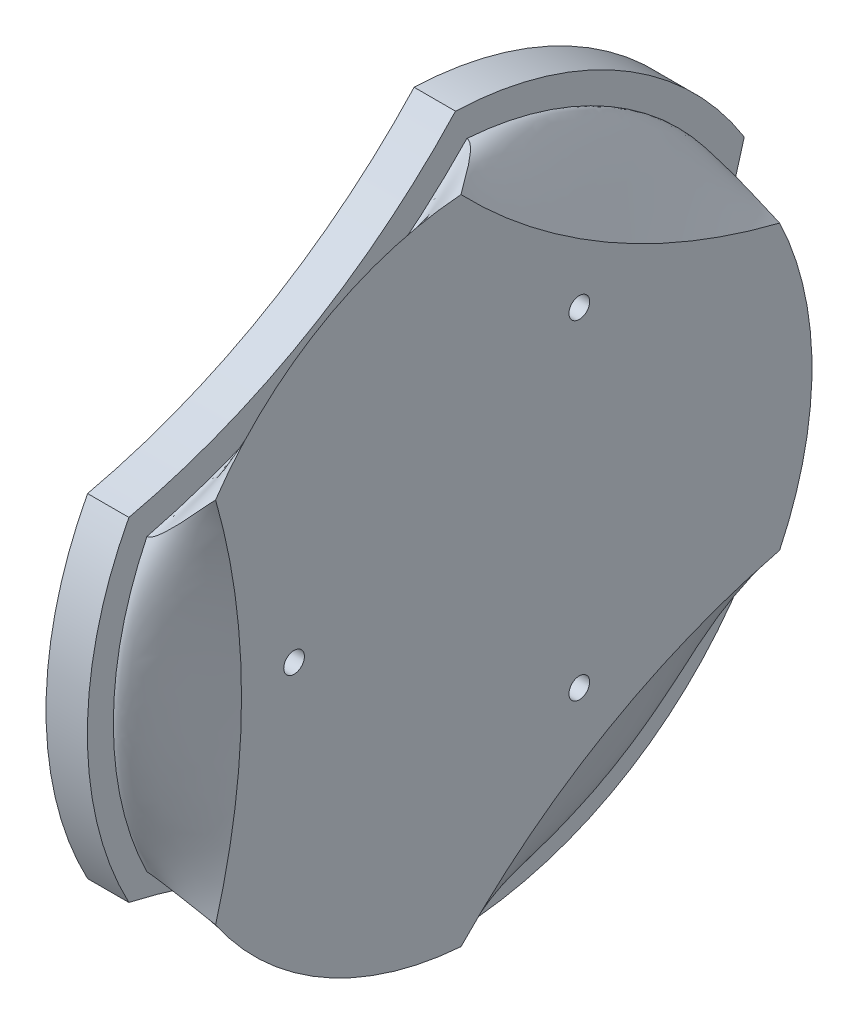
ISO-10303-21;
HEADER;
FILE_DESCRIPTION(('STEP AP214'),'2;1');
FILE_NAME('part.step','',(''),(''),'','','');
FILE_SCHEMA(('AUTOMOTIVE_DESIGN { 1 0 10303 214 1 1 1 1 }'));
ENDSEC;
DATA;
#1=APPLICATION_CONTEXT('core data for automotive mechanical design processes');
#2=APPLICATION_PROTOCOL_DEFINITION('international standard','automotive_design',2000,#1);
#3=PRODUCT_CONTEXT('',#1,'mechanical');
#4=PRODUCT('Part','Part','',(#3));
#5=PRODUCT_RELATED_PRODUCT_CATEGORY('part','',(#4));
#6=PRODUCT_DEFINITION_FORMATION('','',#4);
#7=PRODUCT_DEFINITION_CONTEXT('part definition',#1,'design');
#8=PRODUCT_DEFINITION('design','',#6,#7);
#9=PRODUCT_DEFINITION_SHAPE('','',#8);
#10=(LENGTH_UNIT() NAMED_UNIT(*) SI_UNIT(.MILLI.,.METRE.));
#11=(NAMED_UNIT(*) PLANE_ANGLE_UNIT() SI_UNIT($,.RADIAN.));
#12=(NAMED_UNIT(*) SI_UNIT($,.STERADIAN.) SOLID_ANGLE_UNIT());
#13=UNCERTAINTY_MEASURE_WITH_UNIT(LENGTH_MEASURE(1.E-05),#10,'distance_accuracy_value','');
#14=(GEOMETRIC_REPRESENTATION_CONTEXT(3) GLOBAL_UNCERTAINTY_ASSIGNED_CONTEXT((#13)) GLOBAL_UNIT_ASSIGNED_CONTEXT((#10,
#11,#12)) REPRESENTATION_CONTEXT('',''));
#15=CARTESIAN_POINT('',(0.,0.,0.));
#16=DIRECTION('',(0.,0.,1.));
#17=DIRECTION('',(1.,0.,0.));
#18=AXIS2_PLACEMENT_3D('',#15,#16,#17);
#19=CARTESIAN_POINT('',(0.,81.1226705898772,102.240909226466));
#20=DIRECTION('',(1.,0.,0.));
#21=DIRECTION('',(0.,0.86602540378444,-0.499999999999998));
#22=AXIS2_PLACEMENT_3D('',#19,#20,#21);
#23=PLANE('',#22);
#24=CARTESIAN_POINT('',(0.,129.242914733026,152.882547039961));
#25=DIRECTION('',(1.,0.,0.));
#26=DIRECTION('',(0.,0.,-1.));
#27=AXIS2_PLACEMENT_3D('',#24,#25,#26);
#28=CIRCLE('',#27,1.25000000000001);
#29=CARTESIAN_POINT('',(0.,129.242914733026,151.632547039961));
#30=VERTEX_POINT('',#29);
#31=EDGE_CURVE('E625',#30,#30,#28,.F.);
#32=ORIENTED_EDGE('',*,*,#31,.T.);
#33=EDGE_LOOP('',(#32));
#34=FACE_BOUND('',#33,.T.);
#35=CARTESIAN_POINT('',(0.,149.161499020068,118.382547039961));
#36=DIRECTION('',(1.,0.,0.));
#37=DIRECTION('',(0.,0.,-1.));
#38=AXIS2_PLACEMENT_3D('',#35,#36,#37);
#39=CIRCLE('',#38,1.25);
#40=CARTESIAN_POINT('',(0.,149.161499020068,117.132547039961));
#41=VERTEX_POINT('',#40);
#42=EDGE_CURVE('E626',#41,#41,#39,.F.);
#43=ORIENTED_EDGE('',*,*,#42,.T.);
#44=EDGE_LOOP('',(#43));
#45=FACE_BOUND('',#44,.T.);
#46=CARTESIAN_POINT('',(0.,109.324330445983,118.382547039961));
#47=DIRECTION('',(1.,0.,0.));
#48=DIRECTION('',(0.,0.,-1.));
#49=AXIS2_PLACEMENT_3D('',#46,#47,#48);
#50=CIRCLE('',#49,1.25);
#51=CARTESIAN_POINT('',(0.,109.324330445983,117.132547039961));
#52=VERTEX_POINT('',#51);
#53=EDGE_CURVE('E628',#52,#52,#50,.F.);
#54=ORIENTED_EDGE('',*,*,#53,.T.);
#55=EDGE_LOOP('',(#54));
#56=FACE_BOUND('',#55,.T.);
#57=CARTESIAN_POINT('',(0.,33.4912733817331,74.7409092264656));
#58=DIRECTION('',(-1.,0.,0.));
#59=DIRECTION('',(0.,0.86602540378444,-0.499999999999998));
#60=AXIS2_PLACEMENT_3D('',#57,#58,#59);
#61=CIRCLE('',#60,80.5000000000001);
#62=CARTESIAN_POINT('',(0.,89.3645268236646,132.69286820814));
#63=VERTEX_POINT('',#62);
#64=CARTESIAN_POINT('',(0.,111.615768779903,94.152586608428));
#65=VERTEX_POINT('',#64);
#66=EDGE_CURVE('E498',#63,#65,#61,.T.);
#67=ORIENTED_EDGE('',*,*,#66,.T.);
#68=CARTESIAN_POINT('',(0.,128.754067798021,129.740909226466));
#69=DIRECTION('',(1.,0.,0.));
#70=DIRECTION('',(0.,0.86602540378444,-0.499999999999998));
#71=AXIS2_PLACEMENT_3D('',#68,#69,#70);
#72=CIRCLE('',#71,39.5);
#73=CARTESIAN_POINT('',(0.,145.89236681614,94.1525866084281));
#74=VERTEX_POINT('',#73);
#75=EDGE_CURVE('E12',#65,#74,#72,.T.);
#76=ORIENTED_EDGE('',*,*,#75,.T.);
#77=CARTESIAN_POINT('',(0.,224.01686221431,74.7409092264666));
#78=DIRECTION('',(-1.,0.,0.));
#79=DIRECTION('',(0.,0.86602540378444,-0.499999999999998));
#80=AXIS2_PLACEMENT_3D('',#77,#78,#79);
#81=CIRCLE('',#80,80.5000000000001);
#82=CARTESIAN_POINT('',(0.,168.143608772378,132.692868208141));
#83=VERTEX_POINT('',#82);
#84=EDGE_CURVE('E151',#74,#83,#81,.T.);
#85=ORIENTED_EDGE('',*,*,#84,.T.);
#86=CARTESIAN_POINT('',(0.,128.754067798021,129.740909226466));
#87=DIRECTION('',(1.,0.,0.));
#88=DIRECTION('',(0.,0.86602540378444,-0.499999999999998));
#89=AXIS2_PLACEMENT_3D('',#86,#87,#88);
#90=CIRCLE('',#89,39.5);
#91=CARTESIAN_POINT('',(0.,151.005309754259,162.37727286283));
#92=VERTEX_POINT('',#91);
#93=EDGE_CURVE('E512',#83,#92,#90,.T.);
#94=ORIENTED_EDGE('',*,*,#93,.T.);
#95=CARTESIAN_POINT('',(0.,128.754067798021,239.740909226466));
#96=DIRECTION('',(-1.,0.,0.));
#97=DIRECTION('',(0.,0.86602540378444,-0.499999999999998));
#98=AXIS2_PLACEMENT_3D('',#95,#96,#97);
#99=CIRCLE('',#98,80.5000000000001);
#100=CARTESIAN_POINT('',(0.,106.502825841783,162.37727286283));
#101=VERTEX_POINT('',#100);
#102=EDGE_CURVE('E164',#92,#101,#99,.T.);
#103=ORIENTED_EDGE('',*,*,#102,.T.);
#104=CARTESIAN_POINT('',(0.,128.754067798021,129.740909226466));
#105=DIRECTION('',(1.,0.,0.));
#106=DIRECTION('',(0.,0.86602540378444,-0.499999999999998));
#107=AXIS2_PLACEMENT_3D('',#104,#105,#106);
#108=CIRCLE('',#107,39.5);
#109=EDGE_CURVE('E157',#101,#63,#108,.T.);
#110=ORIENTED_EDGE('',*,*,#109,.T.);
#111=EDGE_LOOP('',(#67,#76,#85,#94,#103,#110));
#112=FACE_BOUND('',#111,.T.);
#113=ADVANCED_FACE('F143',(#34,#45,#56,#112),#23,.T.);
#114=CARTESIAN_POINT('',(-5.,88.8489863312597,126.986917009496));
#115=CARTESIAN_POINT('',(-4.0114556801729,88.8489863312597,126.986917009496));
#116=CARTESIAN_POINT('',(-2.00572784008645,89.1067565774621,129.839892608818));
#117=CARTESIAN_POINT('',(0.,89.3645268236646,132.69286820814));
#118=CARTESIAN_POINT('',(-5.,89.6984129965735,114.67880659781));
#119=CARTESIAN_POINT('',(-4.0114556801729,89.6984129965735,114.67880659781));
#120=CARTESIAN_POINT('',(-2.00572784008645,94.9768947157659,118.435737050697));
#121=CARTESIAN_POINT('',(0.,100.255376434958,122.192667503584));
#122=CARTESIAN_POINT('',(-5.,96.1820768864736,103.448771321304));
#123=CARTESIAN_POINT('',(-4.01145568017291,96.1820768864736,103.448771321304));
#124=CARTESIAN_POINT('',(-2.00572784008645,102.074914958521,106.141605357093));
#125=CARTESIAN_POINT('',(0.,107.967753030569,108.834439392882));
#126=CARTESIAN_POINT('',(-5.,106.41649984292,96.5590910446478));
#127=CARTESIAN_POINT('',(-4.01145568017291,106.41649984292,96.5590910446478));
#128=CARTESIAN_POINT('',(-2.00572784008646,109.016134311411,95.3558388265379));
#129=CARTESIAN_POINT('',(0.,111.615768779903,94.1525866084281));
#130=B_SPLINE_SURFACE_WITH_KNOTS('',3,3,((#114,#115,#116,#117),(#118,#119,#120,#121),(#122,#123,
#124,#125),(#126,#127,#128,#129)),.UNSPECIFIED.,.F.,.F.,.F.,(4,4),(4,4),(0.,1.),(0.,1.),.UNSPECIFIED.);
#131=CARTESIAN_POINT('',(-5.,128.754067798021,129.740909226466));
#132=DIRECTION('',(1.,0.,0.));
#133=DIRECTION('',(0.,0.86602540378444,-0.499999999999998));
#134=AXIS2_PLACEMENT_3D('',#131,#132,#133);
#135=CIRCLE('',#134,40.);
#136=CARTESIAN_POINT('',(-5.,88.8489863312597,126.986917009496));
#137=VERTEX_POINT('',#136);
#138=CARTESIAN_POINT('',(-5.,106.41649984292,96.5590910446478));
#139=VERTEX_POINT('',#138);
#140=EDGE_CURVE('E144',#137,#139,#135,.T.);
#141=CARTESIAN_POINT('',(-5.,106.41649984292,96.5590910446478));
#142=CARTESIAN_POINT('',(-4.01145568017291,106.41649984292,96.5590910446478));
#143=CARTESIAN_POINT('',(-2.00572784008646,109.016134311411,95.3558388265379));
#144=CARTESIAN_POINT('',(0.,111.615768779903,94.1525866084281));
#145=B_SPLINE_CURVE_WITH_KNOTS('',3,(#141,#142,#143,#144),.UNSPECIFIED.,.F.,.F.,(4,4),(0.,1.),.UNSPECIFIED.);
#146=EDGE_CURVE('E427',#139,#65,#145,.T.);
#147=CARTESIAN_POINT('',(-5.,88.8489863312597,126.986917009496));
#148=CARTESIAN_POINT('',(-4.0114556801729,88.8489863312597,126.986917009496));
#149=CARTESIAN_POINT('',(-2.00572784008645,89.1067565774621,129.839892608818));
#150=CARTESIAN_POINT('',(0.,89.3645268236646,132.69286820814));
#151=B_SPLINE_CURVE_WITH_KNOTS('',3,(#147,#148,#149,#150),.UNSPECIFIED.,.F.,.F.,(4,4),(0.,1.),.UNSPECIFIED.);
#152=EDGE_CURVE('E423',#63,#137,#151,.F.);
#153=CARTESIAN_POINT('',(-5.,88.8489863312597,126.986917009496));
#154=CARTESIAN_POINT('',(-4.0114556801729,88.8489863312597,126.986917009496));
#155=CARTESIAN_POINT('',(-2.00572784008645,89.1067565774621,129.839892608818));
#156=CARTESIAN_POINT('',(0.,89.3645268236646,132.69286820814));
#157=CARTESIAN_POINT('',(1.72492594247435E-05,89.3645290404887,132.69289274373));
#158=CARTESIAN_POINT('',(3.44985188494869E-05,89.3645312573129,132.692917279321));
#159=CARTESIAN_POINT('',(5.17477782742304E-05,89.364533474137,132.692941814911));
#160=CARTESIAN_POINT('',(-5.,89.6984129965735,114.67880659781));
#161=CARTESIAN_POINT('',(-4.0114556801729,89.6984129965735,114.67880659781));
#162=CARTESIAN_POINT('',(-2.00572784008645,94.9768947157659,118.435737050697));
#163=CARTESIAN_POINT('',(0.,100.255376434958,122.192667503584));
#164=CARTESIAN_POINT('',(1.72492594247435E-05,100.255421829901,122.192699813186));
#165=CARTESIAN_POINT('',(3.4498518849487E-05,100.255467224844,122.192732122788));
#166=CARTESIAN_POINT('',(5.17477782742304E-05,100.255512619787,122.19276443239));
#167=CARTESIAN_POINT('',(-5.,96.1820768864736,103.448771321304));
#168=CARTESIAN_POINT('',(-4.01145568017291,96.1820768864736,103.448771321304));
#169=CARTESIAN_POINT('',(-2.00572784008645,102.074914958521,106.141605357093));
#170=CARTESIAN_POINT('',(0.,107.967753030569,108.834439392882));
#171=CARTESIAN_POINT('',(1.72492594247435E-05,107.967803708976,108.834462551255));
#172=CARTESIAN_POINT('',(3.4498518849487E-05,107.967854387384,108.834485709628));
#173=CARTESIAN_POINT('',(5.17477782742305E-05,107.967905065791,108.834508868));
#174=CARTESIAN_POINT('',(-5.,106.41649984292,96.5590910446478));
#175=CARTESIAN_POINT('',(-4.01145568017291,106.41649984292,96.5590910446478));
#176=CARTESIAN_POINT('',(-2.00572784008646,109.016134311411,95.3558388265379));
#177=CARTESIAN_POINT('',(0.,111.615768779903,94.1525866084281));
#178=CARTESIAN_POINT('',(1.72492594247435E-05,111.615791136759,94.152576260459));
#179=CARTESIAN_POINT('',(3.4498518849487E-05,111.615813493616,94.1525659124899));
#180=CARTESIAN_POINT('',(5.17477782742305E-05,111.615835850472,94.1525555645208));
#181=B_SPLINE_SURFACE_WITH_KNOTS('',3,3,((#153,#154,#155,#156,#157,#158,#159),(#160,#161,#162,
#163,#164,#165,#166),(#167,#168,#169,#170,#171,#172,#173),(#174,#175,#176,#177,#178,#179,#180)),
.UNSPECIFIED.,.F.,.F.,.F.,(4,4),(4,3,4),(0.,1.),(0.,1.,1.0000086),.UNSPECIFIED.);
#182=ORIENTED_EDGE('',*,*,#140,.T.);
#183=ORIENTED_EDGE('',*,*,#146,.T.);
#184=ORIENTED_EDGE('',*,*,#66,.F.);
#185=ORIENTED_EDGE('',*,*,#152,.T.);
#186=EDGE_LOOP('',(#182,#183,#184,#185));
#187=FACE_BOUND('',#186,.T.);
#188=ADVANCED_FACE('F443',(#187),#181,.T.);
#189=CARTESIAN_POINT('',(-5.,106.41649984292,96.5590910446477));
#190=CARTESIAN_POINT('',(-4.01145568017291,106.41649984292,96.5590910446477));
#191=CARTESIAN_POINT('',(-2.00572784008645,109.016134311411,95.3558388265379));
#192=CARTESIAN_POINT('',(0.,111.615768779903,94.152586608428));
#193=CARTESIAN_POINT('',(-5.,121.005493386461,100.801350194268));
#194=CARTESIAN_POINT('',(-4.0114556801729,121.005493386461,100.801350194268));
#195=CARTESIAN_POINT('',(-2.00572784008645,121.725345968693,94.8693995141673));
#196=CARTESIAN_POINT('',(0.,122.445198550925,88.9374488340664));
#197=CARTESIAN_POINT('',(-5.,136.502642209581,100.801350194268));
#198=CARTESIAN_POINT('',(-4.01145568017289,136.502642209581,100.801350194268));
#199=CARTESIAN_POINT('',(-2.00572784008644,135.782789627349,94.8693995141673));
#200=CARTESIAN_POINT('',(0.,135.062937045117,88.9374488340664));
#201=CARTESIAN_POINT('',(-5.,151.091635753123,96.559091044648));
#202=CARTESIAN_POINT('',(-4.01145568017288,151.091635753123,96.559091044648));
#203=CARTESIAN_POINT('',(-2.00572784008644,148.492001284631,95.3558388265381));
#204=CARTESIAN_POINT('',(0.,145.89236681614,94.1525866084281));
#205=B_SPLINE_SURFACE_WITH_KNOTS('',3,3,((#189,#190,#191,#192),(#193,#194,#195,#196),(#197,#198,
#199,#200),(#201,#202,#203,#204)),.UNSPECIFIED.,.F.,.F.,.F.,(4,4),(4,4),(0.,1.),(0.,1.),.UNSPECIFIED.);
#206=CARTESIAN_POINT('',(-5.,128.754067798022,19.740909226466));
#207=DIRECTION('',(-1.,0.,0.));
#208=DIRECTION('',(0.,0.86602540378444,-0.499999999999998));
#209=AXIS2_PLACEMENT_3D('',#206,#207,#208);
#210=CIRCLE('',#209,80.0000000000001);
#211=CARTESIAN_POINT('',(-5.,151.091635753123,96.5590910446481));
#212=VERTEX_POINT('',#211);
#213=EDGE_CURVE('E477',#139,#212,#210,.T.);
#214=CARTESIAN_POINT('',(-5.,151.091635753123,96.559091044648));
#215=CARTESIAN_POINT('',(-4.01145568017288,151.091635753123,96.559091044648));
#216=CARTESIAN_POINT('',(-2.00572784008644,148.492001284631,95.3558388265381));
#217=CARTESIAN_POINT('',(0.,145.89236681614,94.1525866084281));
#218=B_SPLINE_CURVE_WITH_KNOTS('',3,(#214,#215,#216,#217),.UNSPECIFIED.,.F.,.F.,(4,4),(0.,1.),.UNSPECIFIED.);
#219=EDGE_CURVE('E539',#212,#74,#218,.T.);
#220=ORIENTED_EDGE('',*,*,#213,.T.);
#221=ORIENTED_EDGE('',*,*,#219,.T.);
#222=ORIENTED_EDGE('',*,*,#75,.F.);
#223=ORIENTED_EDGE('',*,*,#146,.F.);
#224=EDGE_LOOP('',(#220,#221,#222,#223));
#225=FACE_BOUND('',#224,.T.);
#226=ADVANCED_FACE('F404',(#225),#205,.T.);
#227=CARTESIAN_POINT('',(-5.,111.186554286361,165.676719625254));
#228=CARTESIAN_POINT('',(-4.01145568017291,111.186554286361,165.676719625254));
#229=CARTESIAN_POINT('',(-2.00572784008645,108.844690064072,164.026996244042));
#230=CARTESIAN_POINT('',(0.,106.502825841783,162.37727286283));
#231=CARTESIAN_POINT('',(-5.,107.565961707598,150.92115102609));
#232=CARTESIAN_POINT('',(-4.0114556801729,107.565961707598,150.92115102609));
#233=CARTESIAN_POINT('',(-2.00572784008645,102.068815433519,153.263715742948));
#234=CARTESIAN_POINT('',(0.,96.5716691594388,155.606280459805));
#235=CARTESIAN_POINT('',(-5.,99.8173872960383,137.50022645904));
#236=CARTESIAN_POINT('',(-4.0114556801729,99.8173872960383,137.50022645904));
#237=CARTESIAN_POINT('',(-2.00572784008645,95.0400936041905,141.089612422283));
#238=CARTESIAN_POINT('',(0.,90.2627999123428,144.678998385526));
#239=CARTESIAN_POINT('',(-5.,88.8489863312597,126.986917009496));
#240=CARTESIAN_POINT('',(-4.0114556801729,88.8489863312597,126.986917009496));
#241=CARTESIAN_POINT('',(-2.00572784008645,89.1067565774622,129.839892608818));
#242=CARTESIAN_POINT('',(0.,89.3645268236646,132.69286820814));
#243=B_SPLINE_SURFACE_WITH_KNOTS('',3,3,((#227,#228,#229,#230),(#231,#232,#233,#234),(#235,#236,
#237,#238),(#239,#240,#241,#242)),.UNSPECIFIED.,.F.,.F.,.F.,(4,4),(4,4),(0.,1.),(0.,1.),.UNSPECIFIED.);
#244=CARTESIAN_POINT('',(-5.,33.4912733817325,184.740909226465));
#245=DIRECTION('',(-1.,0.,0.));
#246=DIRECTION('',(0.,0.86602540378444,-0.499999999999998));
#247=AXIS2_PLACEMENT_3D('',#244,#245,#246);
#248=CIRCLE('',#247,80.);
#249=CARTESIAN_POINT('',(-5.,111.186554286361,165.676719625254));
#250=VERTEX_POINT('',#249);
#251=EDGE_CURVE('E261',#250,#137,#248,.T.);
#252=CARTESIAN_POINT('',(-5.,111.186554286361,165.676719625254));
#253=CARTESIAN_POINT('',(-4.01145568017291,111.186554286361,165.676719625254));
#254=CARTESIAN_POINT('',(-2.00572784008645,108.844690064072,164.026996244042));
#255=CARTESIAN_POINT('',(0.,106.502825841783,162.37727286283));
#256=B_SPLINE_CURVE_WITH_KNOTS('',3,(#252,#253,#254,#255),.UNSPECIFIED.,.F.,.F.,(4,4),(0.,1.),.UNSPECIFIED.);
#257=EDGE_CURVE('E541',#250,#101,#256,.T.);
#258=ORIENTED_EDGE('',*,*,#251,.T.);
#259=ORIENTED_EDGE('',*,*,#152,.F.);
#260=ORIENTED_EDGE('',*,*,#109,.F.);
#261=ORIENTED_EDGE('',*,*,#257,.F.);
#262=EDGE_LOOP('',(#258,#259,#260,#261));
#263=FACE_BOUND('',#262,.T.);
#264=ADVANCED_FACE('F392',(#263),#243,.T.);
#265=CARTESIAN_POINT('',(-5.,151.091635753123,96.559091044648));
#266=CARTESIAN_POINT('',(-4.01145568017288,151.091635753123,96.559091044648));
#267=CARTESIAN_POINT('',(-2.00572784008644,148.492001284631,95.3558388265381));
#268=CARTESIAN_POINT('',(0.,145.89236681614,94.1525866084281));
#269=CARTESIAN_POINT('',(-5.,161.326058709569,103.448771321305));
#270=CARTESIAN_POINT('',(-4.01145568017288,161.326058709569,103.448771321305));
#271=CARTESIAN_POINT('',(-2.00572784008644,155.433220637521,106.141605357093));
#272=CARTESIAN_POINT('',(0.,149.540382565474,108.834439392882));
#273=CARTESIAN_POINT('',(-5.,167.809722599469,114.678806597811));
#274=CARTESIAN_POINT('',(-4.01145568017289,167.809722599469,114.678806597811));
#275=CARTESIAN_POINT('',(-2.00572784008644,162.531240880277,118.435737050698));
#276=CARTESIAN_POINT('',(0.,157.252759161084,122.192667503585));
#277=CARTESIAN_POINT('',(-5.,168.659149264783,126.986917009497));
#278=CARTESIAN_POINT('',(-4.01145568017289,168.659149264783,126.986917009497));
#279=CARTESIAN_POINT('',(-2.00572784008645,168.40137901858,129.839892608819));
#280=CARTESIAN_POINT('',(0.,168.143608772378,132.692868208141));
#281=B_SPLINE_SURFACE_WITH_KNOTS('',3,3,((#265,#266,#267,#268),(#269,#270,#271,#272),(#273,#274,
#275,#276),(#277,#278,#279,#280)),.UNSPECIFIED.,.F.,.F.,.F.,(4,4),(4,4),(0.,1.),(0.,1.),.UNSPECIFIED.);
#282=CARTESIAN_POINT('',(-5.,128.754067798021,129.740909226466));
#283=DIRECTION('',(1.,0.,0.));
#284=DIRECTION('',(0.,0.86602540378444,-0.499999999999998));
#285=AXIS2_PLACEMENT_3D('',#282,#283,#284);
#286=CIRCLE('',#285,40.0000000000001);
#287=CARTESIAN_POINT('',(-5.,168.659149264783,126.986917009497));
#288=VERTEX_POINT('',#287);
#289=EDGE_CURVE('E480',#212,#288,#286,.T.);
#290=CARTESIAN_POINT('',(-5.,168.659149264783,126.986917009497));
#291=CARTESIAN_POINT('',(-4.01145568017289,168.659149264783,126.986917009497));
#292=CARTESIAN_POINT('',(-2.00572784008645,168.40137901858,129.839892608819));
#293=CARTESIAN_POINT('',(0.,168.143608772378,132.692868208141));
#294=B_SPLINE_CURVE_WITH_KNOTS('',3,(#290,#291,#292,#293),.UNSPECIFIED.,.F.,.F.,(4,4),(0.,1.),.UNSPECIFIED.);
#295=EDGE_CURVE('E333',#288,#83,#294,.T.);
#296=CARTESIAN_POINT('',(-5.,151.091635753123,96.559091044648));
#297=CARTESIAN_POINT('',(-4.01145568017288,151.091635753123,96.559091044648));
#298=CARTESIAN_POINT('',(-2.00572784008644,148.492001284631,95.3558388265381));
#299=CARTESIAN_POINT('',(0.,145.89236681614,94.1525866084281));
#300=CARTESIAN_POINT('',(1.72492594247434E-05,145.892344459283,94.152576260459));
#301=CARTESIAN_POINT('',(3.44985188494868E-05,145.892322102427,94.15256591249));
#302=CARTESIAN_POINT('',(5.17477782742301E-05,145.892299745571,94.1525555645209));
#303=CARTESIAN_POINT('',(-5.,161.326058709569,103.448771321305));
#304=CARTESIAN_POINT('',(-4.01145568017288,161.326058709569,103.448771321305));
#305=CARTESIAN_POINT('',(-2.00572784008644,155.433220637521,106.141605357093));
#306=CARTESIAN_POINT('',(0.,149.540382565474,108.834439392882));
#307=CARTESIAN_POINT('',(1.72492594247434E-05,149.540331887066,108.834462551255));
#308=CARTESIAN_POINT('',(3.44985188494868E-05,149.540281208659,108.834485709628));
#309=CARTESIAN_POINT('',(5.17477782742302E-05,149.540230530251,108.834508868));
#310=CARTESIAN_POINT('',(-5.,167.809722599469,114.678806597811));
#311=CARTESIAN_POINT('',(-4.01145568017289,167.809722599469,114.678806597811));
#312=CARTESIAN_POINT('',(-2.00572784008644,162.531240880277,118.435737050698));
#313=CARTESIAN_POINT('',(0.,157.252759161084,122.192667503585));
#314=CARTESIAN_POINT('',(1.72492594247434E-05,157.252713766141,122.192699813187));
#315=CARTESIAN_POINT('',(3.44985188494868E-05,157.252668371198,122.192732122789));
#316=CARTESIAN_POINT('',(5.17477782742303E-05,157.252622976256,122.19276443239));
#317=CARTESIAN_POINT('',(-5.,168.659149264783,126.986917009497));
#318=CARTESIAN_POINT('',(-4.01145568017289,168.659149264783,126.986917009497));
#319=CARTESIAN_POINT('',(-2.00572784008645,168.40137901858,129.839892608819));
#320=CARTESIAN_POINT('',(0.,168.143608772378,132.692868208141));
#321=CARTESIAN_POINT('',(1.72492594247434E-05,168.143606555554,132.692892743731));
#322=CARTESIAN_POINT('',(3.44985188494869E-05,168.143604338729,132.692917279321));
#323=CARTESIAN_POINT('',(5.17477782742303E-05,168.143602121905,132.692941814911));
#324=B_SPLINE_SURFACE_WITH_KNOTS('',3,3,((#296,#297,#298,#299,#300,#301,#302),(#303,#304,#305,
#306,#307,#308,#309),(#310,#311,#312,#313,#314,#315,#316),(#317,#318,#319,#320,#321,#322,#323)),
.UNSPECIFIED.,.F.,.F.,.F.,(4,4),(4,3,4),(0.,1.),(0.,1.,1.0000086),.UNSPECIFIED.);
#325=ORIENTED_EDGE('',*,*,#289,.T.);
#326=ORIENTED_EDGE('',*,*,#295,.T.);
#327=ORIENTED_EDGE('',*,*,#84,.F.);
#328=ORIENTED_EDGE('',*,*,#219,.F.);
#329=EDGE_LOOP('',(#325,#326,#327,#328));
#330=FACE_BOUND('',#329,.T.);
#331=ADVANCED_FACE('F346',(#330),#324,.T.);
#332=CARTESIAN_POINT('',(-5.,168.659149264783,126.986917009497));
#333=CARTESIAN_POINT('',(-4.01145568017289,168.659149264783,126.986917009497));
#334=CARTESIAN_POINT('',(-2.00572784008645,168.40137901858,129.839892608819));
#335=CARTESIAN_POINT('',(0.,168.143608772378,132.692868208141));
#336=CARTESIAN_POINT('',(-5.,157.690748300004,137.50022645904));
#337=CARTESIAN_POINT('',(-4.01145568017289,157.690748300004,137.50022645904));
#338=CARTESIAN_POINT('',(-2.00572784008645,162.468041991852,141.089612422283));
#339=CARTESIAN_POINT('',(0.,167.245335683699,144.678998385527));
#340=CARTESIAN_POINT('',(-5.,149.942173888444,150.92115102609));
#341=CARTESIAN_POINT('',(-4.01145568017289,149.942173888444,150.92115102609));
#342=CARTESIAN_POINT('',(-2.00572784008644,155.439320162524,153.263715742948));
#343=CARTESIAN_POINT('',(0.,160.936466436603,155.606280459806));
#344=CARTESIAN_POINT('',(-5.,146.321581309681,165.676719625254));
#345=CARTESIAN_POINT('',(-4.01145568017288,146.321581309681,165.676719625254));
#346=CARTESIAN_POINT('',(-2.00572784008644,148.66344553197,164.026996244042));
#347=CARTESIAN_POINT('',(0.,151.005309754259,162.37727286283));
#348=B_SPLINE_SURFACE_WITH_KNOTS('',3,3,((#332,#333,#334,#335),(#336,#337,#338,#339),(#340,#341,
#342,#343),(#344,#345,#346,#347)),.UNSPECIFIED.,.F.,.F.,.F.,(4,4),(4,4),(0.,1.),(0.,1.),.UNSPECIFIED.);
#349=CARTESIAN_POINT('',(-5.,224.016862214309,184.740909226467));
#350=DIRECTION('',(-1.,0.,0.));
#351=DIRECTION('',(0.,0.86602540378444,-0.499999999999998));
#352=AXIS2_PLACEMENT_3D('',#349,#350,#351);
#353=CIRCLE('',#352,80.0000000000001);
#354=CARTESIAN_POINT('',(-5.,146.321581309681,165.676719625254));
#355=VERTEX_POINT('',#354);
#356=EDGE_CURVE('E329',#288,#355,#353,.T.);
#357=CARTESIAN_POINT('',(-5.,146.321581309681,165.676719625254));
#358=CARTESIAN_POINT('',(-4.01145568017288,146.321581309681,165.676719625254));
#359=CARTESIAN_POINT('',(-2.00572784008644,148.66344553197,164.026996244042));
#360=CARTESIAN_POINT('',(0.,151.005309754259,162.37727286283));
#361=B_SPLINE_CURVE_WITH_KNOTS('',3,(#357,#358,#359,#360),.UNSPECIFIED.,.F.,.F.,(4,4),(0.,1.),.UNSPECIFIED.);
#362=EDGE_CURVE('E538',#355,#92,#361,.T.);
#363=ORIENTED_EDGE('',*,*,#356,.T.);
#364=ORIENTED_EDGE('',*,*,#362,.T.);
#365=ORIENTED_EDGE('',*,*,#93,.F.);
#366=ORIENTED_EDGE('',*,*,#295,.F.);
#367=EDGE_LOOP('',(#363,#364,#365,#366));
#368=FACE_BOUND('',#367,.T.);
#369=ADVANCED_FACE('F340',(#368),#348,.T.);
#370=CARTESIAN_POINT('',(-5.,146.321581309681,165.676719625254));
#371=CARTESIAN_POINT('',(-4.01145568017288,146.321581309681,165.676719625254));
#372=CARTESIAN_POINT('',(-2.00572784008644,148.66344553197,164.026996244042));
#373=CARTESIAN_POINT('',(0.,151.005309754259,162.37727286283));
#374=CARTESIAN_POINT('',(-5.,135.237731687921,171.095149760283));
#375=CARTESIAN_POINT('',(-4.01145568017289,135.237731687921,171.095149760283));
#376=CARTESIAN_POINT('',(-2.00572784008645,135.852088040776,164.645385271607));
#377=CARTESIAN_POINT('',(0.,136.466444393631,158.195620782932));
#378=CARTESIAN_POINT('',(-5.,122.270403908121,171.095149760283));
#379=CARTESIAN_POINT('',(-4.0114556801729,122.270403908121,171.095149760283));
#380=CARTESIAN_POINT('',(-2.00572784008645,121.656047555266,164.645385271607));
#381=CARTESIAN_POINT('',(0.,121.041691202411,158.195620782932));
#382=CARTESIAN_POINT('',(-5.,111.186554286361,165.676719625254));
#383=CARTESIAN_POINT('',(-4.01145568017291,111.186554286361,165.676719625254));
#384=CARTESIAN_POINT('',(-2.00572784008645,108.844690064072,164.026996244042));
#385=CARTESIAN_POINT('',(0.,106.502825841783,162.37727286283));
#386=B_SPLINE_SURFACE_WITH_KNOTS('',3,3,((#370,#371,#372,#373),(#374,#375,#376,#377),(#378,#379,
#380,#381),(#382,#383,#384,#385)),.UNSPECIFIED.,.F.,.F.,.F.,(4,4),(4,4),(0.,1.),(0.,1.),.UNSPECIFIED.);
#387=CARTESIAN_POINT('',(-5.,128.754067798021,129.740909226466));
#388=DIRECTION('',(1.,0.,0.));
#389=DIRECTION('',(0.,0.86602540378444,-0.499999999999998));
#390=AXIS2_PLACEMENT_3D('',#387,#388,#389);
#391=CIRCLE('',#390,40.0000000000001);
#392=EDGE_CURVE('E256',#355,#250,#391,.T.);
#393=CARTESIAN_POINT('',(-5.,146.321581309681,165.676719625254));
#394=CARTESIAN_POINT('',(-4.01145568017288,146.321581309681,165.676719625254));
#395=CARTESIAN_POINT('',(-2.00572784008644,148.66344553197,164.026996244042));
#396=CARTESIAN_POINT('',(0.,151.005309754259,162.37727286283));
#397=CARTESIAN_POINT('',(1.72492594247434E-05,151.005329894291,162.377258675209));
#398=CARTESIAN_POINT('',(3.44985188494868E-05,151.005350034324,162.377244487588));
#399=CARTESIAN_POINT('',(5.17477782742302E-05,151.005370174356,162.377230299967));
#400=CARTESIAN_POINT('',(-5.,135.237731687921,171.095149760283));
#401=CARTESIAN_POINT('',(-4.01145568017289,135.237731687921,171.095149760283));
#402=CARTESIAN_POINT('',(-2.00572784008645,135.852088040776,164.645385271607));
#403=CARTESIAN_POINT('',(0.,136.466444393631,158.195620782932));
#404=CARTESIAN_POINT('',(1.72492594247434E-05,136.466449677096,158.195565314957));
#405=CARTESIAN_POINT('',(3.44985188494869E-05,136.466454960561,158.195509846982));
#406=CARTESIAN_POINT('',(5.17477782742303E-05,136.466460244025,158.195454379008));
#407=CARTESIAN_POINT('',(-5.,122.270403908121,171.095149760283));
#408=CARTESIAN_POINT('',(-4.0114556801729,122.270403908121,171.095149760283));
#409=CARTESIAN_POINT('',(-2.00572784008645,121.656047555266,164.645385271607));
#410=CARTESIAN_POINT('',(0.,121.041691202411,158.195620782932));
#411=CARTESIAN_POINT('',(1.72492594247435E-05,121.041685918946,158.195565314957));
#412=CARTESIAN_POINT('',(3.44985188494869E-05,121.041680635481,158.195509846982));
#413=CARTESIAN_POINT('',(5.17477782742304E-05,121.041675352017,158.195454379008));
#414=CARTESIAN_POINT('',(-5.,111.186554286361,165.676719625254));
#415=CARTESIAN_POINT('',(-4.01145568017291,111.186554286361,165.676719625254));
#416=CARTESIAN_POINT('',(-2.00572784008645,108.844690064072,164.026996244042));
#417=CARTESIAN_POINT('',(0.,106.502825841783,162.37727286283));
#418=CARTESIAN_POINT('',(1.72492594247435E-05,106.502805701751,162.377258675209));
#419=CARTESIAN_POINT('',(3.4498518849487E-05,106.502785561719,162.377244487587));
#420=CARTESIAN_POINT('',(5.17477782742305E-05,106.502765421686,162.377230299966));
#421=B_SPLINE_SURFACE_WITH_KNOTS('',3,3,((#393,#394,#395,#396,#397,#398,#399),(#400,#401,#402,
#403,#404,#405,#406),(#407,#408,#409,#410,#411,#412,#413),(#414,#415,#416,#417,#418,#419,#420)),
.UNSPECIFIED.,.F.,.F.,.F.,(4,4),(4,3,4),(0.,1.),(0.,1.,1.0000086),.UNSPECIFIED.);
#422=ORIENTED_EDGE('',*,*,#392,.T.);
#423=ORIENTED_EDGE('',*,*,#257,.T.);
#424=ORIENTED_EDGE('',*,*,#102,.F.);
#425=ORIENTED_EDGE('',*,*,#362,.F.);
#426=EDGE_LOOP('',(#422,#423,#424,#425));
#427=FACE_BOUND('',#426,.T.);
#428=ADVANCED_FACE('F284',(#427),#421,.T.);
#429=CARTESIAN_POINT('',(-5.,176.874311941171,157.382547039961));
#430=DIRECTION('',(-1.,0.,0.));
#431=DIRECTION('',(0.,0.,1.));
#432=AXIS2_PLACEMENT_3D('',#429,#430,#431);
#433=PLANE('',#432);
#434=CARTESIAN_POINT('',(-5.,224.505709149315,184.882547039961));
#435=DIRECTION('',(1.,0.,0.));
#436=DIRECTION('',(0.,0.,1.));
#437=AXIS2_PLACEMENT_3D('',#434,#435,#436);
#438=CIRCLE('',#437,77.0000000000001);
#439=CARTESIAN_POINT('',(-5.,149.410998110786,167.859492847486));
#440=VERTEX_POINT('',#439);
#441=CARTESIAN_POINT('',(-5.,172.215956249368,128.360146686981));
#442=VERTEX_POINT('',#441);
#443=EDGE_CURVE('E260',#440,#442,#438,.T.);
#444=ORIENTED_EDGE('',*,*,#443,.F.);
#445=CARTESIAN_POINT('',(-5.,129.242914733026,129.882547039961));
#446=DIRECTION('',(-1.,0.,0.));
#447=DIRECTION('',(0.,0.,1.));
#448=AXIS2_PLACEMENT_3D('',#445,#446,#447);
#449=CIRCLE('',#448,43.0000000000001);
#450=CARTESIAN_POINT('',(-5.,109.074831355267,167.859492847487));
#451=VERTEX_POINT('',#450);
#452=EDGE_CURVE('E251',#451,#440,#449,.T.);
#453=ORIENTED_EDGE('',*,*,#452,.F.);
#454=CARTESIAN_POINT('',(-5.,33.9801203167382,184.882547039961));
#455=DIRECTION('',(1.,0.,0.));
#456=DIRECTION('',(0.,0.,1.));
#457=AXIS2_PLACEMENT_3D('',#454,#455,#456);
#458=CIRCLE('',#457,77.0000000000001);
#459=CARTESIAN_POINT('',(-5.,86.2698732166844,128.360146686981));
#460=VERTEX_POINT('',#459);
#461=EDGE_CURVE('E654',#460,#451,#458,.T.);
#462=ORIENTED_EDGE('',*,*,#461,.F.);
#463=CARTESIAN_POINT('',(-5.,129.242914733026,129.882547039961));
#464=DIRECTION('',(-1.,0.,0.));
#465=DIRECTION('',(0.,0.,1.));
#466=AXIS2_PLACEMENT_3D('',#463,#464,#465);
#467=CIRCLE('',#466,43.);
#468=CARTESIAN_POINT('',(-5.,106.437956594444,93.4280015854155));
#469=VERTEX_POINT('',#468);
#470=EDGE_CURVE('E653',#469,#460,#467,.T.);
#471=ORIENTED_EDGE('',*,*,#470,.F.);
#472=CARTESIAN_POINT('',(-5.,129.242914733026,19.8825470399608));
#473=DIRECTION('',(1.,0.,0.));
#474=DIRECTION('',(0.,0.,1.));
#475=AXIS2_PLACEMENT_3D('',#472,#473,#474);
#476=CIRCLE('',#475,77.0000000000001);
#477=CARTESIAN_POINT('',(-5.,152.047872871608,93.4280015854154));
#478=VERTEX_POINT('',#477);
#479=EDGE_CURVE('E651',#478,#469,#476,.T.);
#480=ORIENTED_EDGE('',*,*,#479,.F.);
#481=CARTESIAN_POINT('',(-5.,129.242914733026,129.882547039961));
#482=DIRECTION('',(-1.,0.,0.));
#483=DIRECTION('',(0.,0.,1.));
#484=AXIS2_PLACEMENT_3D('',#481,#482,#483);
#485=CIRCLE('',#484,43.);
#486=EDGE_CURVE('E648',#442,#478,#485,.T.);
#487=ORIENTED_EDGE('',*,*,#486,.F.);
#488=EDGE_LOOP('',(#444,#453,#462,#471,#480,#487));
#489=FACE_BOUND('',#488,.T.);
#490=ORIENTED_EDGE('',*,*,#251,.F.);
#491=ORIENTED_EDGE('',*,*,#392,.F.);
#492=ORIENTED_EDGE('',*,*,#356,.F.);
#493=ORIENTED_EDGE('',*,*,#289,.F.);
#494=ORIENTED_EDGE('',*,*,#213,.F.);
#495=ORIENTED_EDGE('',*,*,#140,.F.);
#496=EDGE_LOOP('',(#490,#491,#492,#493,#494,#495));
#497=FACE_BOUND('',#496,.T.);
#498=ADVANCED_FACE('F274',(#489,#497),#433,.F.);
#499=CARTESIAN_POINT('',(-10.,224.505709149315,184.882547039961));
#500=DIRECTION('',(1.,0.,0.));
#501=DIRECTION('',(0.,0.,-1.));
#502=AXIS2_PLACEMENT_3D('',#499,#500,#501);
#503=CYLINDRICAL_SURFACE('',#502,77.0000000000001);
#504=ORIENTED_EDGE('',*,*,#443,.T.);
#505=DIRECTION('',(1.,0.,0.));
#506=VECTOR('',#505,1.);
#507=CARTESIAN_POINT('',(-10.,172.215956249368,128.360146686981));
#508=LINE('',#507,#506);
#509=CARTESIAN_POINT('',(-10.,172.215956249368,128.360146686981));
#510=VERTEX_POINT('',#509);
#511=EDGE_CURVE('E240',#510,#442,#508,.T.);
#512=ORIENTED_EDGE('',*,*,#511,.F.);
#513=CARTESIAN_POINT('',(-10.,224.505709149315,184.882547039961));
#514=DIRECTION('',(1.,0.,0.));
#515=DIRECTION('',(0.,0.,1.));
#516=AXIS2_PLACEMENT_3D('',#513,#514,#515);
#517=CIRCLE('',#516,77.0000000000001);
#518=CARTESIAN_POINT('',(-10.,149.410998110786,167.859492847486));
#519=VERTEX_POINT('',#518);
#520=EDGE_CURVE('E243',#519,#510,#517,.T.);
#521=ORIENTED_EDGE('',*,*,#520,.F.);
#522=DIRECTION('',(1.,0.,0.));
#523=VECTOR('',#522,1.);
#524=CARTESIAN_POINT('',(-10.,149.410998110786,167.859492847486));
#525=LINE('',#524,#523);
#526=EDGE_CURVE('E646',#519,#440,#525,.T.);
#527=ORIENTED_EDGE('',*,*,#526,.T.);
#528=EDGE_LOOP('',(#504,#512,#521,#527));
#529=FACE_BOUND('',#528,.T.);
#530=ADVANCED_FACE('F254',(#529),#503,.F.);
#531=CARTESIAN_POINT('',(-10.,129.242914733026,129.882547039961));
#532=DIRECTION('',(1.,0.,0.));
#533=DIRECTION('',(0.,0.,-1.));
#534=AXIS2_PLACEMENT_3D('',#531,#532,#533);
#535=CYLINDRICAL_SURFACE('',#534,43.);
#536=ORIENTED_EDGE('',*,*,#486,.T.);
#537=DIRECTION('',(1.,0.,0.));
#538=VECTOR('',#537,1.);
#539=CARTESIAN_POINT('',(-10.,152.047872871608,93.4280015854154));
#540=LINE('',#539,#538);
#541=CARTESIAN_POINT('',(-10.,152.047872871608,93.4280015854154));
#542=VERTEX_POINT('',#541);
#543=EDGE_CURVE('E238',#542,#478,#540,.T.);
#544=ORIENTED_EDGE('',*,*,#543,.F.);
#545=CARTESIAN_POINT('',(-10.,129.242914733026,129.882547039961));
#546=DIRECTION('',(-1.,0.,0.));
#547=DIRECTION('',(0.,0.,1.));
#548=AXIS2_PLACEMENT_3D('',#545,#546,#547);
#549=CIRCLE('',#548,43.);
#550=EDGE_CURVE('E232',#510,#542,#549,.T.);
#551=ORIENTED_EDGE('',*,*,#550,.F.);
#552=ORIENTED_EDGE('',*,*,#511,.T.);
#553=EDGE_LOOP('',(#536,#544,#551,#552));
#554=FACE_BOUND('',#553,.T.);
#555=ADVANCED_FACE('F231',(#554),#535,.T.);
#556=CARTESIAN_POINT('',(-10.,129.242914733026,19.8825470399608));
#557=DIRECTION('',(1.,0.,0.));
#558=DIRECTION('',(0.,0.,-1.));
#559=AXIS2_PLACEMENT_3D('',#556,#557,#558);
#560=CYLINDRICAL_SURFACE('',#559,77.0000000000001);
#561=ORIENTED_EDGE('',*,*,#479,.T.);
#562=DIRECTION('',(1.,0.,0.));
#563=VECTOR('',#562,1.);
#564=CARTESIAN_POINT('',(-10.,106.437956594444,93.4280015854155));
#565=LINE('',#564,#563);
#566=CARTESIAN_POINT('',(-10.,106.437956594444,93.4280015854155));
#567=VERTEX_POINT('',#566);
#568=EDGE_CURVE('E263',#567,#469,#565,.T.);
#569=ORIENTED_EDGE('',*,*,#568,.F.);
#570=CARTESIAN_POINT('',(-10.,129.242914733026,19.8825470399608));
#571=DIRECTION('',(1.,0.,0.));
#572=DIRECTION('',(0.,0.,1.));
#573=AXIS2_PLACEMENT_3D('',#570,#571,#572);
#574=CIRCLE('',#573,77.0000000000001);
#575=EDGE_CURVE('E242',#542,#567,#574,.T.);
#576=ORIENTED_EDGE('',*,*,#575,.F.);
#577=ORIENTED_EDGE('',*,*,#543,.T.);
#578=EDGE_LOOP('',(#561,#569,#576,#577));
#579=FACE_BOUND('',#578,.T.);
#580=ADVANCED_FACE('F678',(#579),#560,.F.);
#581=CARTESIAN_POINT('',(-10.,129.242914733026,129.882547039961));
#582=DIRECTION('',(1.,0.,0.));
#583=DIRECTION('',(0.,0.,-1.));
#584=AXIS2_PLACEMENT_3D('',#581,#582,#583);
#585=CYLINDRICAL_SURFACE('',#584,43.);
#586=ORIENTED_EDGE('',*,*,#470,.T.);
#587=DIRECTION('',(1.,0.,0.));
#588=VECTOR('',#587,1.);
#589=CARTESIAN_POINT('',(-10.,86.2698732166844,128.360146686981));
#590=LINE('',#589,#588);
#591=CARTESIAN_POINT('',(-10.,86.2698732166844,128.360146686981));
#592=VERTEX_POINT('',#591);
#593=EDGE_CURVE('E665',#592,#460,#590,.T.);
#594=ORIENTED_EDGE('',*,*,#593,.F.);
#595=CARTESIAN_POINT('',(-10.,129.242914733026,129.882547039961));
#596=DIRECTION('',(-1.,0.,0.));
#597=DIRECTION('',(0.,0.,1.));
#598=AXIS2_PLACEMENT_3D('',#595,#596,#597);
#599=CIRCLE('',#598,43.);
#600=EDGE_CURVE('E643',#567,#592,#599,.T.);
#601=ORIENTED_EDGE('',*,*,#600,.F.);
#602=ORIENTED_EDGE('',*,*,#568,.T.);
#603=EDGE_LOOP('',(#586,#594,#601,#602));
#604=FACE_BOUND('',#603,.T.);
#605=ADVANCED_FACE('F668',(#604),#585,.T.);
#606=CARTESIAN_POINT('',(-10.,33.9801203167382,184.882547039961));
#607=DIRECTION('',(1.,0.,0.));
#608=DIRECTION('',(0.,0.,-1.));
#609=AXIS2_PLACEMENT_3D('',#606,#607,#608);
#610=CYLINDRICAL_SURFACE('',#609,77.0000000000001);
#611=ORIENTED_EDGE('',*,*,#461,.T.);
#612=DIRECTION('',(1.,0.,0.));
#613=VECTOR('',#612,1.);
#614=CARTESIAN_POINT('',(-10.,109.074831355267,167.859492847487));
#615=LINE('',#614,#613);
#616=CARTESIAN_POINT('',(-10.,109.074831355267,167.859492847487));
#617=VERTEX_POINT('',#616);
#618=EDGE_CURVE('E658',#617,#451,#615,.T.);
#619=ORIENTED_EDGE('',*,*,#618,.F.);
#620=CARTESIAN_POINT('',(-10.,33.9801203167382,184.882547039961));
#621=DIRECTION('',(1.,0.,0.));
#622=DIRECTION('',(0.,0.,1.));
#623=AXIS2_PLACEMENT_3D('',#620,#621,#622);
#624=CIRCLE('',#623,77.0000000000001);
#625=EDGE_CURVE('E641',#592,#617,#624,.T.);
#626=ORIENTED_EDGE('',*,*,#625,.F.);
#627=ORIENTED_EDGE('',*,*,#593,.T.);
#628=EDGE_LOOP('',(#611,#619,#626,#627));
#629=FACE_BOUND('',#628,.T.);
#630=ADVANCED_FACE('F680',(#629),#610,.F.);
#631=CARTESIAN_POINT('',(-10.,129.242914733026,129.882547039961));
#632=DIRECTION('',(1.,0.,0.));
#633=DIRECTION('',(0.,0.,-1.));
#634=AXIS2_PLACEMENT_3D('',#631,#632,#633);
#635=CYLINDRICAL_SURFACE('',#634,43.0000000000001);
#636=ORIENTED_EDGE('',*,*,#452,.T.);
#637=ORIENTED_EDGE('',*,*,#526,.F.);
#638=CARTESIAN_POINT('',(-10.,129.242914733026,129.882547039961));
#639=DIRECTION('',(-1.,0.,0.));
#640=DIRECTION('',(0.,0.,1.));
#641=AXIS2_PLACEMENT_3D('',#638,#639,#640);
#642=CIRCLE('',#641,43.0000000000001);
#643=EDGE_CURVE('E250',#617,#519,#642,.T.);
#644=ORIENTED_EDGE('',*,*,#643,.F.);
#645=ORIENTED_EDGE('',*,*,#618,.T.);
#646=EDGE_LOOP('',(#636,#637,#644,#645));
#647=FACE_BOUND('',#646,.T.);
#648=ADVANCED_FACE('F287',(#647),#635,.T.);
#649=CARTESIAN_POINT('',(-10.,176.874311941171,157.382547039961));
#650=DIRECTION('',(-1.,0.,0.));
#651=DIRECTION('',(0.,0.,1.));
#652=AXIS2_PLACEMENT_3D('',#649,#650,#651);
#653=PLANE('',#652);
#654=CARTESIAN_POINT('',(-10.,129.242914733026,152.882547039961));
#655=DIRECTION('',(-1.,0.,0.));
#656=DIRECTION('',(0.,0.,1.));
#657=AXIS2_PLACEMENT_3D('',#654,#655,#656);
#658=CIRCLE('',#657,1.25000000000001);
#659=CARTESIAN_POINT('',(-10.,129.242914733026,154.132547039961));
#660=VERTEX_POINT('',#659);
#661=EDGE_CURVE('E647',#660,#660,#658,.T.);
#662=ORIENTED_EDGE('',*,*,#661,.F.);
#663=EDGE_LOOP('',(#662));
#664=FACE_BOUND('',#663,.T.);
#665=CARTESIAN_POINT('',(-10.,149.161499020068,118.382547039961));
#666=DIRECTION('',(-1.,0.,0.));
#667=DIRECTION('',(0.,0.,1.));
#668=AXIS2_PLACEMENT_3D('',#665,#666,#667);
#669=CIRCLE('',#668,1.25);
#670=CARTESIAN_POINT('',(-10.,149.161499020068,119.632547039961));
#671=VERTEX_POINT('',#670);
#672=EDGE_CURVE('E633',#671,#671,#669,.T.);
#673=ORIENTED_EDGE('',*,*,#672,.F.);
#674=EDGE_LOOP('',(#673));
#675=FACE_BOUND('',#674,.T.);
#676=CARTESIAN_POINT('',(-10.,109.324330445983,118.382547039961));
#677=DIRECTION('',(-1.,0.,0.));
#678=DIRECTION('',(0.,0.,1.));
#679=AXIS2_PLACEMENT_3D('',#676,#677,#678);
#680=CIRCLE('',#679,1.25);
#681=CARTESIAN_POINT('',(-10.,109.324330445983,119.632547039961));
#682=VERTEX_POINT('',#681);
#683=EDGE_CURVE('E634',#682,#682,#680,.T.);
#684=ORIENTED_EDGE('',*,*,#683,.F.);
#685=EDGE_LOOP('',(#684));
#686=FACE_BOUND('',#685,.T.);
#687=ORIENTED_EDGE('',*,*,#520,.T.);
#688=ORIENTED_EDGE('',*,*,#550,.T.);
#689=ORIENTED_EDGE('',*,*,#575,.T.);
#690=ORIENTED_EDGE('',*,*,#600,.T.);
#691=ORIENTED_EDGE('',*,*,#625,.T.);
#692=ORIENTED_EDGE('',*,*,#643,.T.);
#693=EDGE_LOOP('',(#687,#688,#689,#690,#691,#692));
#694=FACE_BOUND('',#693,.T.);
#695=ADVANCED_FACE('F249',(#664,#675,#686,#694),#653,.T.);
#696=CARTESIAN_POINT('',(0.00558224088720305,109.324330445983,118.382547039961));
#697=DIRECTION('',(-1.,0.,0.));
#698=DIRECTION('',(0.,0.,1.));
#699=AXIS2_PLACEMENT_3D('',#696,#697,#698);
#700=CYLINDRICAL_SURFACE('',#699,1.25);
#701=ORIENTED_EDGE('',*,*,#53,.F.);
#702=EDGE_LOOP('',(#701));
#703=FACE_BOUND('',#702,.T.);
#704=ORIENTED_EDGE('',*,*,#683,.T.);
#705=EDGE_LOOP('',(#704));
#706=FACE_BOUND('',#705,.T.);
#707=ADVANCED_FACE('F691',(#703,#706),#700,.F.);
#708=CARTESIAN_POINT('',(0.00558224088720305,149.161499020068,118.382547039961));
#709=DIRECTION('',(-1.,0.,0.));
#710=DIRECTION('',(0.,0.,1.));
#711=AXIS2_PLACEMENT_3D('',#708,#709,#710);
#712=CYLINDRICAL_SURFACE('',#711,1.25);
#713=ORIENTED_EDGE('',*,*,#42,.F.);
#714=EDGE_LOOP('',(#713));
#715=FACE_BOUND('',#714,.T.);
#716=ORIENTED_EDGE('',*,*,#672,.T.);
#717=EDGE_LOOP('',(#716));
#718=FACE_BOUND('',#717,.T.);
#719=ADVANCED_FACE('F696',(#715,#718),#712,.F.);
#720=CARTESIAN_POINT('',(0.00558224088720305,129.242914733026,152.882547039961));
#721=DIRECTION('',(-1.,0.,0.));
#722=DIRECTION('',(0.,0.,1.));
#723=AXIS2_PLACEMENT_3D('',#720,#721,#722);
#724=CYLINDRICAL_SURFACE('',#723,1.25000000000001);
#725=ORIENTED_EDGE('',*,*,#31,.F.);
#726=EDGE_LOOP('',(#725));
#727=FACE_BOUND('',#726,.T.);
#728=ORIENTED_EDGE('',*,*,#661,.T.);
#729=EDGE_LOOP('',(#728));
#730=FACE_BOUND('',#729,.T.);
#731=ADVANCED_FACE('F708',(#727,#730),#724,.F.);
#732=CLOSED_SHELL('',(#113,#188,#226,#264,#331,#369,#428,#498,#530,#555,#580,#605,#630,#648,
#695,#707,#719,#731));
#733=MANIFOLD_SOLID_BREP('B2',#732);
#734=ADVANCED_BREP_SHAPE_REPRESENTATION('',(#18,#733),#14);
#735=SHAPE_DEFINITION_REPRESENTATION(#9,#734);
ENDSEC;
END-ISO-10303-21;
